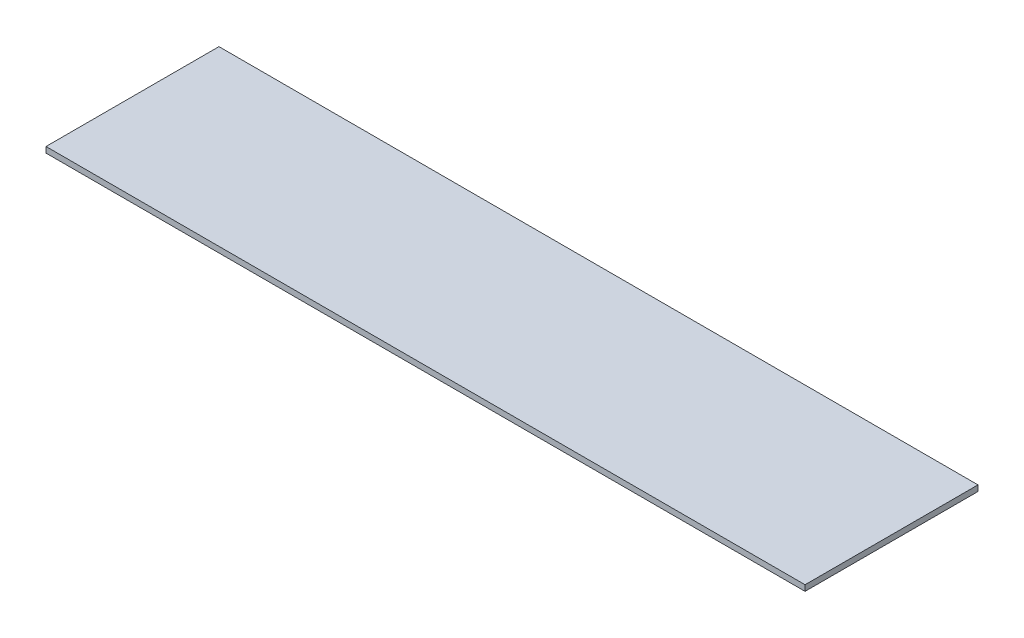
ISO-10303-21;
HEADER;
FILE_DESCRIPTION(('STEP AP214'),'2;1');
FILE_NAME('part.step','',(''),(''),'','','');
FILE_SCHEMA(('AUTOMOTIVE_DESIGN { 1 0 10303 214 1 1 1 1 }'));
ENDSEC;
DATA;
#1=APPLICATION_CONTEXT('core data for automotive mechanical design processes');
#2=APPLICATION_PROTOCOL_DEFINITION('international standard','automotive_design',2000,#1);
#3=PRODUCT_CONTEXT('',#1,'mechanical');
#4=PRODUCT('Part','Part','',(#3));
#5=PRODUCT_RELATED_PRODUCT_CATEGORY('part','',(#4));
#6=PRODUCT_DEFINITION_FORMATION('','',#4);
#7=PRODUCT_DEFINITION_CONTEXT('part definition',#1,'design');
#8=PRODUCT_DEFINITION('design','',#6,#7);
#9=PRODUCT_DEFINITION_SHAPE('','',#8);
#10=(LENGTH_UNIT() NAMED_UNIT(*) SI_UNIT(.MILLI.,.METRE.));
#11=(NAMED_UNIT(*) PLANE_ANGLE_UNIT() SI_UNIT($,.RADIAN.));
#12=(NAMED_UNIT(*) SI_UNIT($,.STERADIAN.) SOLID_ANGLE_UNIT());
#13=UNCERTAINTY_MEASURE_WITH_UNIT(LENGTH_MEASURE(1.E-05),#10,'distance_accuracy_value','');
#14=(GEOMETRIC_REPRESENTATION_CONTEXT(3) GLOBAL_UNCERTAINTY_ASSIGNED_CONTEXT((#13)) GLOBAL_UNIT_ASSIGNED_CONTEXT((#10,
#11,#12)) REPRESENTATION_CONTEXT('',''));
#15=CARTESIAN_POINT('',(0.,0.,0.));
#16=DIRECTION('',(0.,0.,1.));
#17=DIRECTION('',(1.,0.,0.));
#18=AXIS2_PLACEMENT_3D('',#15,#16,#17);
#19=CARTESIAN_POINT('',(357.422709601246,-0.01,2.09805924412666));
#20=DIRECTION('',(1.,0.,0.));
#21=DIRECTION('',(0.,0.,-1.));
#22=AXIS2_PLACEMENT_3D('',#19,#20,#21);
#23=PLANE('',#22);
#24=DIRECTION('',(0.,-1.,0.));
#25=VECTOR('',#24,1.);
#26=CARTESIAN_POINT('',(357.422709601246,3.,2.09805924412666));
#27=LINE('',#26,#25);
#28=CARTESIAN_POINT('',(357.422709601246,3.,2.09805924412666));
#29=VERTEX_POINT('',#28);
#30=CARTESIAN_POINT('',(357.422709601246,0.,2.09805924412666));
#31=VERTEX_POINT('',#30);
#32=EDGE_CURVE('E87',#29,#31,#27,.T.);
#33=ORIENTED_EDGE('',*,*,#32,.T.);
#34=DIRECTION('',(0.,0.,-1.));
#35=VECTOR('',#34,1.);
#36=CARTESIAN_POINT('',(357.422709601246,0.,1.10227478256448E-12));
#37=LINE('',#36,#35);
#38=CARTESIAN_POINT('',(357.422709601246,0.,-87.9019407558733));
#39=VERTEX_POINT('',#38);
#40=EDGE_CURVE('E81',#31,#39,#37,.T.);
#41=ORIENTED_EDGE('',*,*,#40,.T.);
#42=DIRECTION('',(0.,1.,0.));
#43=VECTOR('',#42,1.);
#44=CARTESIAN_POINT('',(357.422709601246,3.,-87.9019407558733));
#45=LINE('',#44,#43);
#46=CARTESIAN_POINT('',(357.422709601246,3.,-87.9019407558733));
#47=VERTEX_POINT('',#46);
#48=EDGE_CURVE('E85',#39,#47,#45,.T.);
#49=ORIENTED_EDGE('',*,*,#48,.T.);
#50=DIRECTION('',(0.,0.,-1.));
#51=VECTOR('',#50,1.);
#52=CARTESIAN_POINT('',(357.422709601246,3.,1.10227478256448E-12));
#53=LINE('',#52,#51);
#54=EDGE_CURVE('E69',#29,#47,#53,.T.);
#55=ORIENTED_EDGE('',*,*,#54,.F.);
#56=EDGE_LOOP('',(#33,#41,#49,#55));
#57=FACE_BOUND('',#56,.T.);
#58=ADVANCED_FACE('F32',(#57),#23,.T.);
#59=CARTESIAN_POINT('',(-37.5772903987541,3.,-87.9019407558733));
#60=DIRECTION('',(0.,0.,1.));
#61=DIRECTION('',(1.,0.,0.));
#62=AXIS2_PLACEMENT_3D('',#59,#60,#61);
#63=PLANE('',#62);
#64=ORIENTED_EDGE('',*,*,#48,.F.);
#65=DIRECTION('',(-1.,0.,0.));
#66=VECTOR('',#65,1.);
#67=CARTESIAN_POINT('',(-37.5772903987541,0.,-87.9019407558733));
#68=LINE('',#67,#66);
#69=CARTESIAN_POINT('',(-37.5772903987541,0.,-87.9019407558733));
#70=VERTEX_POINT('',#69);
#71=EDGE_CURVE('E77',#39,#70,#68,.T.);
#72=ORIENTED_EDGE('',*,*,#71,.T.);
#73=DIRECTION('',(0.,-1.,0.));
#74=VECTOR('',#73,1.);
#75=CARTESIAN_POINT('',(-37.5772903987541,3.,-87.9019407558733));
#76=LINE('',#75,#74);
#77=CARTESIAN_POINT('',(-37.5772903987541,3.,-87.9019407558733));
#78=VERTEX_POINT('',#77);
#79=EDGE_CURVE('E94',#78,#70,#76,.T.);
#80=ORIENTED_EDGE('',*,*,#79,.F.);
#81=DIRECTION('',(-1.,0.,0.));
#82=VECTOR('',#81,1.);
#83=CARTESIAN_POINT('',(-37.5772903987541,3.,-87.9019407558733));
#84=LINE('',#83,#82);
#85=EDGE_CURVE('E61',#47,#78,#84,.T.);
#86=ORIENTED_EDGE('',*,*,#85,.F.);
#87=EDGE_LOOP('',(#64,#72,#80,#86));
#88=FACE_BOUND('',#87,.T.);
#89=ADVANCED_FACE('F86',(#88),#63,.F.);
#90=CARTESIAN_POINT('',(-37.5772903987541,3.,-87.9019407558733));
#91=DIRECTION('',(1.,0.,0.));
#92=DIRECTION('',(0.,0.,-1.));
#93=AXIS2_PLACEMENT_3D('',#90,#91,#92);
#94=PLANE('',#93);
#95=DIRECTION('',(0.,0.,1.));
#96=VECTOR('',#95,1.);
#97=CARTESIAN_POINT('',(-37.5772903987541,0.,-87.9019407558733));
#98=LINE('',#97,#96);
#99=CARTESIAN_POINT('',(-37.5772903987541,0.,2.09805924412666));
#100=VERTEX_POINT('',#99);
#101=EDGE_CURVE('E11',#70,#100,#98,.T.);
#102=ORIENTED_EDGE('',*,*,#101,.T.);
#103=DIRECTION('',(0.,-1.,0.));
#104=VECTOR('',#103,1.);
#105=CARTESIAN_POINT('',(-37.5772903987541,3.,2.09805924412666));
#106=LINE('',#105,#104);
#107=CARTESIAN_POINT('',(-37.5772903987541,3.,2.09805924412666));
#108=VERTEX_POINT('',#107);
#109=EDGE_CURVE('E101',#108,#100,#106,.T.);
#110=ORIENTED_EDGE('',*,*,#109,.F.);
#111=DIRECTION('',(0.,0.,1.));
#112=VECTOR('',#111,1.);
#113=CARTESIAN_POINT('',(-37.5772903987541,3.,-87.9019407558733));
#114=LINE('',#113,#112);
#115=EDGE_CURVE('E84',#78,#108,#114,.T.);
#116=ORIENTED_EDGE('',*,*,#115,.F.);
#117=ORIENTED_EDGE('',*,*,#79,.T.);
#118=EDGE_LOOP('',(#102,#110,#116,#117));
#119=FACE_BOUND('',#118,.T.);
#120=ADVANCED_FACE('F105',(#119),#94,.F.);
#121=CARTESIAN_POINT('',(-37.5772903987541,3.,2.09805924412666));
#122=DIRECTION('',(0.,0.,-1.));
#123=DIRECTION('',(-1.,0.,0.));
#124=AXIS2_PLACEMENT_3D('',#121,#122,#123);
#125=PLANE('',#124);
#126=ORIENTED_EDGE('',*,*,#32,.F.);
#127=DIRECTION('',(1.,0.,0.));
#128=VECTOR('',#127,1.);
#129=CARTESIAN_POINT('',(-37.5772903987541,3.,2.09805924412666));
#130=LINE('',#129,#128);
#131=EDGE_CURVE('E93',#108,#29,#130,.T.);
#132=ORIENTED_EDGE('',*,*,#131,.F.);
#133=ORIENTED_EDGE('',*,*,#109,.T.);
#134=DIRECTION('',(1.,0.,0.));
#135=VECTOR('',#134,1.);
#136=CARTESIAN_POINT('',(-37.5772903987541,0.,2.09805924412666));
#137=LINE('',#136,#135);
#138=EDGE_CURVE('E36',#100,#31,#137,.T.);
#139=ORIENTED_EDGE('',*,*,#138,.T.);
#140=EDGE_LOOP('',(#126,#132,#133,#139));
#141=FACE_BOUND('',#140,.T.);
#142=ADVANCED_FACE('F107',(#141),#125,.F.);
#143=CARTESIAN_POINT('',(0.,0.,0.));
#144=DIRECTION('',(0.,1.,0.));
#145=DIRECTION('',(0.,0.,1.));
#146=AXIS2_PLACEMENT_3D('',#143,#144,#145);
#147=PLANE('',#146);
#148=ORIENTED_EDGE('',*,*,#40,.F.);
#149=ORIENTED_EDGE('',*,*,#138,.F.);
#150=ORIENTED_EDGE('',*,*,#101,.F.);
#151=ORIENTED_EDGE('',*,*,#71,.F.);
#152=EDGE_LOOP('',(#148,#149,#150,#151));
#153=FACE_BOUND('',#152,.T.);
#154=ADVANCED_FACE('F79',(#153),#147,.F.);
#155=CARTESIAN_POINT('',(0.,3.,0.));
#156=DIRECTION('',(0.,1.,0.));
#157=DIRECTION('',(0.,0.,1.));
#158=AXIS2_PLACEMENT_3D('',#155,#156,#157);
#159=PLANE('',#158);
#160=ORIENTED_EDGE('',*,*,#131,.T.);
#161=ORIENTED_EDGE('',*,*,#54,.T.);
#162=ORIENTED_EDGE('',*,*,#85,.T.);
#163=ORIENTED_EDGE('',*,*,#115,.T.);
#164=EDGE_LOOP('',(#160,#161,#162,#163));
#165=FACE_BOUND('',#164,.T.);
#166=ADVANCED_FACE('F34',(#165),#159,.T.);
#167=CLOSED_SHELL('',(#58,#89,#120,#142,#154,#166));
#168=MANIFOLD_SOLID_BREP('B2',#167);
#169=ADVANCED_BREP_SHAPE_REPRESENTATION('',(#18,#168),#14);
#170=SHAPE_DEFINITION_REPRESENTATION(#9,#169);
ENDSEC;
END-ISO-10303-21;
